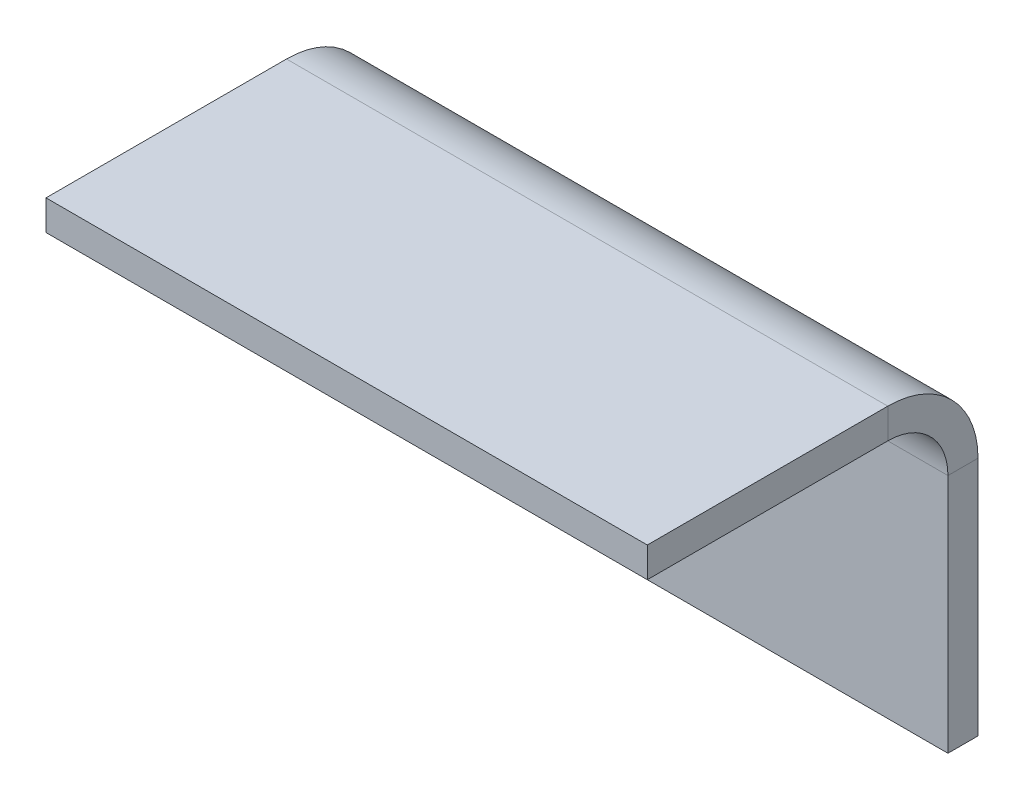
ISO-10303-21;
HEADER;
FILE_DESCRIPTION(('STEP AP214'),'2;1');
FILE_NAME('part.step','',(''),(''),'','','');
FILE_SCHEMA(('AUTOMOTIVE_DESIGN { 1 0 10303 214 1 1 1 1 }'));
ENDSEC;
DATA;
#1=APPLICATION_CONTEXT('core data for automotive mechanical design processes');
#2=APPLICATION_PROTOCOL_DEFINITION('international standard','automotive_design',2000,#1);
#3=PRODUCT_CONTEXT('',#1,'mechanical');
#4=PRODUCT('Part','Part','',(#3));
#5=PRODUCT_RELATED_PRODUCT_CATEGORY('part','',(#4));
#6=PRODUCT_DEFINITION_FORMATION('','',#4);
#7=PRODUCT_DEFINITION_CONTEXT('part definition',#1,'design');
#8=PRODUCT_DEFINITION('design','',#6,#7);
#9=PRODUCT_DEFINITION_SHAPE('','',#8);
#10=(LENGTH_UNIT() NAMED_UNIT(*) SI_UNIT(.MILLI.,.METRE.));
#11=(NAMED_UNIT(*) PLANE_ANGLE_UNIT() SI_UNIT($,.RADIAN.));
#12=(NAMED_UNIT(*) SI_UNIT($,.STERADIAN.) SOLID_ANGLE_UNIT());
#13=UNCERTAINTY_MEASURE_WITH_UNIT(LENGTH_MEASURE(1.E-05),#10,'distance_accuracy_value','');
#14=(GEOMETRIC_REPRESENTATION_CONTEXT(3) GLOBAL_UNCERTAINTY_ASSIGNED_CONTEXT((#13)) GLOBAL_UNIT_ASSIGNED_CONTEXT((#10,
#11,#12)) REPRESENTATION_CONTEXT('',''));
#15=CARTESIAN_POINT('',(0.,0.,0.));
#16=DIRECTION('',(0.,0.,1.));
#17=DIRECTION('',(1.,0.,0.));
#18=AXIS2_PLACEMENT_3D('',#15,#16,#17);
#19=CARTESIAN_POINT('',(0.,0.,-1.));
#20=DIRECTION('',(-1.,0.,0.));
#21=DIRECTION('',(0.,0.,1.));
#22=AXIS2_PLACEMENT_3D('',#19,#20,#21);
#23=PLANE('',#22);
#24=DIRECTION('',(0.,-1.,0.));
#25=VECTOR('',#24,1.);
#26=CARTESIAN_POINT('',(0.,0.,0.));
#27=LINE('',#26,#25);
#28=CARTESIAN_POINT('',(0.,8.00000000000001,0.));
#29=VERTEX_POINT('',#28);
#30=CARTESIAN_POINT('',(0.,0.,0.));
#31=VERTEX_POINT('',#30);
#32=EDGE_CURVE('E96',#29,#31,#27,.T.);
#33=ORIENTED_EDGE('',*,*,#32,.F.);
#34=DIRECTION('',(0.,0.,-1.));
#35=VECTOR('',#34,1.);
#36=CARTESIAN_POINT('',(0.,8.00000000000001,0.));
#37=LINE('',#36,#35);
#38=CARTESIAN_POINT('',(0.,8.00000000000001,-1.));
#39=VERTEX_POINT('',#38);
#40=EDGE_CURVE('E104',#29,#39,#37,.T.);
#41=ORIENTED_EDGE('',*,*,#40,.T.);
#42=DIRECTION('',(0.,-1.,0.));
#43=VECTOR('',#42,1.);
#44=CARTESIAN_POINT('',(0.,0.,-1.));
#45=LINE('',#44,#43);
#46=CARTESIAN_POINT('',(0.,0.,-1.));
#47=VERTEX_POINT('',#46);
#48=EDGE_CURVE('E95',#39,#47,#45,.T.);
#49=ORIENTED_EDGE('',*,*,#48,.T.);
#50=DIRECTION('',(0.,0.,1.));
#51=VECTOR('',#50,1.);
#52=CARTESIAN_POINT('',(0.,0.,-1.));
#53=LINE('',#52,#51);
#54=EDGE_CURVE('E50',#47,#31,#53,.T.);
#55=ORIENTED_EDGE('',*,*,#54,.T.);
#56=EDGE_LOOP('',(#33,#41,#49,#55));
#57=FACE_BOUND('',#56,.T.);
#58=ADVANCED_FACE('F42',(#57),#23,.T.);
#59=CARTESIAN_POINT('',(0.,0.,-1.));
#60=DIRECTION('',(0.,0.,-1.));
#61=DIRECTION('',(-1.,0.,0.));
#62=AXIS2_PLACEMENT_3D('',#59,#60,#61);
#63=PLANE('',#62);
#64=ORIENTED_EDGE('',*,*,#48,.F.);
#65=DIRECTION('',(-1.,0.,0.));
#66=VECTOR('',#65,1.);
#67=CARTESIAN_POINT('',(0.,8.00000000000001,-1.));
#68=LINE('',#67,#66);
#69=CARTESIAN_POINT('',(20.,8.00000000000001,-1.));
#70=VERTEX_POINT('',#69);
#71=EDGE_CURVE('E125',#39,#70,#68,.F.);
#72=ORIENTED_EDGE('',*,*,#71,.T.);
#73=DIRECTION('',(0.,1.,0.));
#74=VECTOR('',#73,1.);
#75=CARTESIAN_POINT('',(20.,0.,-1.));
#76=LINE('',#75,#74);
#77=CARTESIAN_POINT('',(20.,0.,-1.));
#78=VERTEX_POINT('',#77);
#79=EDGE_CURVE('E101',#78,#70,#76,.T.);
#80=ORIENTED_EDGE('',*,*,#79,.F.);
#81=DIRECTION('',(1.,0.,0.));
#82=VECTOR('',#81,1.);
#83=CARTESIAN_POINT('',(0.,0.,-1.));
#84=LINE('',#83,#82);
#85=EDGE_CURVE('E84',#47,#78,#84,.T.);
#86=ORIENTED_EDGE('',*,*,#85,.F.);
#87=EDGE_LOOP('',(#64,#72,#80,#86));
#88=FACE_BOUND('',#87,.T.);
#89=ADVANCED_FACE('F212',(#88),#63,.T.);
#90=CARTESIAN_POINT('',(0.,0.,0.));
#91=DIRECTION('',(0.,0.,-1.));
#92=DIRECTION('',(-1.,0.,0.));
#93=AXIS2_PLACEMENT_3D('',#90,#91,#92);
#94=PLANE('',#93);
#95=DIRECTION('',(-1.,0.,0.));
#96=VECTOR('',#95,1.);
#97=CARTESIAN_POINT('',(0.,8.00000000000001,0.));
#98=LINE('',#97,#96);
#99=CARTESIAN_POINT('',(20.,8.00000000000001,0.));
#100=VERTEX_POINT('',#99);
#101=EDGE_CURVE('E115',#29,#100,#98,.F.);
#102=ORIENTED_EDGE('',*,*,#101,.F.);
#103=ORIENTED_EDGE('',*,*,#32,.T.);
#104=DIRECTION('',(1.,0.,0.));
#105=VECTOR('',#104,1.);
#106=CARTESIAN_POINT('',(0.,0.,0.));
#107=LINE('',#106,#105);
#108=CARTESIAN_POINT('',(20.,0.,0.));
#109=VERTEX_POINT('',#108);
#110=EDGE_CURVE('E81',#31,#109,#107,.T.);
#111=ORIENTED_EDGE('',*,*,#110,.T.);
#112=DIRECTION('',(0.,1.,0.));
#113=VECTOR('',#112,1.);
#114=CARTESIAN_POINT('',(20.,0.,0.));
#115=LINE('',#114,#113);
#116=EDGE_CURVE('E88',#109,#100,#115,.T.);
#117=ORIENTED_EDGE('',*,*,#116,.T.);
#118=EDGE_LOOP('',(#102,#103,#111,#117));
#119=FACE_BOUND('',#118,.T.);
#120=ADVANCED_FACE('F94',(#119),#94,.F.);
#121=CARTESIAN_POINT('',(20.,0.,-1.));
#122=DIRECTION('',(1.,0.,0.));
#123=DIRECTION('',(0.,0.,-1.));
#124=AXIS2_PLACEMENT_3D('',#121,#122,#123);
#125=PLANE('',#124);
#126=DIRECTION('',(0.,0.,-1.));
#127=VECTOR('',#126,1.);
#128=CARTESIAN_POINT('',(20.,8.00000000000001,0.));
#129=LINE('',#128,#127);
#130=EDGE_CURVE('E90',#100,#70,#129,.T.);
#131=ORIENTED_EDGE('',*,*,#130,.F.);
#132=ORIENTED_EDGE('',*,*,#116,.F.);
#133=DIRECTION('',(0.,0.,1.));
#134=VECTOR('',#133,1.);
#135=CARTESIAN_POINT('',(20.,0.,-1.));
#136=LINE('',#135,#134);
#137=EDGE_CURVE('E11',#78,#109,#136,.T.);
#138=ORIENTED_EDGE('',*,*,#137,.F.);
#139=ORIENTED_EDGE('',*,*,#79,.T.);
#140=EDGE_LOOP('',(#131,#132,#138,#139));
#141=FACE_BOUND('',#140,.T.);
#142=ADVANCED_FACE('F87',(#141),#125,.T.);
#143=CARTESIAN_POINT('',(0.,0.,-1.));
#144=DIRECTION('',(0.,-1.,0.));
#145=DIRECTION('',(0.,0.,-1.));
#146=AXIS2_PLACEMENT_3D('',#143,#144,#145);
#147=PLANE('',#146);
#148=ORIENTED_EDGE('',*,*,#110,.F.);
#149=ORIENTED_EDGE('',*,*,#54,.F.);
#150=ORIENTED_EDGE('',*,*,#85,.T.);
#151=ORIENTED_EDGE('',*,*,#137,.T.);
#152=EDGE_LOOP('',(#148,#149,#150,#151));
#153=FACE_BOUND('',#152,.T.);
#154=ADVANCED_FACE('F77',(#153),#147,.T.);
#155=CARTESIAN_POINT('',(20.,8.00000000000001,2.));
#156=DIRECTION('',(1.,0.,0.));
#157=DIRECTION('',(0.,0.,-1.));
#158=AXIS2_PLACEMENT_3D('',#155,#156,#157);
#159=PLANE('',#158);
#160=DIRECTION('',(0.,1.,0.));
#161=VECTOR('',#160,1.);
#162=CARTESIAN_POINT('',(20.,10.,1.99999999999999));
#163=LINE('',#162,#161);
#164=CARTESIAN_POINT('',(20.,10.,1.99999999999999));
#165=VERTEX_POINT('',#164);
#166=CARTESIAN_POINT('',(20.,11.,1.99999999999998));
#167=VERTEX_POINT('',#166);
#168=EDGE_CURVE('E155',#165,#167,#163,.T.);
#169=ORIENTED_EDGE('',*,*,#168,.F.);
#170=CARTESIAN_POINT('',(20.,8.00000000000001,2.));
#171=DIRECTION('',(-1.,0.,0.));
#172=DIRECTION('',(0.,0.,1.));
#173=AXIS2_PLACEMENT_3D('',#170,#171,#172);
#174=CIRCLE('',#173,2.);
#175=EDGE_CURVE('E118',#100,#165,#174,.F.);
#176=ORIENTED_EDGE('',*,*,#175,.F.);
#177=ORIENTED_EDGE('',*,*,#130,.T.);
#178=CARTESIAN_POINT('',(20.,8.00000000000001,2.));
#179=DIRECTION('',(-1.,0.,0.));
#180=DIRECTION('',(0.,0.,1.));
#181=AXIS2_PLACEMENT_3D('',#178,#179,#180);
#182=CIRCLE('',#181,3.);
#183=EDGE_CURVE('E59',#70,#167,#182,.F.);
#184=ORIENTED_EDGE('',*,*,#183,.T.);
#185=EDGE_LOOP('',(#169,#176,#177,#184));
#186=FACE_BOUND('',#185,.T.);
#187=ADVANCED_FACE('F204',(#186),#159,.T.);
#188=CARTESIAN_POINT('',(0.,8.00000000000001,2.));
#189=DIRECTION('',(1.,0.,0.));
#190=DIRECTION('',(0.,0.,-1.));
#191=AXIS2_PLACEMENT_3D('',#188,#189,#190);
#192=PLANE('',#191);
#193=CARTESIAN_POINT('',(0.,8.00000000000001,2.));
#194=DIRECTION('',(-1.,0.,0.));
#195=DIRECTION('',(0.,0.,1.));
#196=AXIS2_PLACEMENT_3D('',#193,#194,#195);
#197=CIRCLE('',#196,2.);
#198=CARTESIAN_POINT('',(0.,10.,1.99999999999999));
#199=VERTEX_POINT('',#198);
#200=EDGE_CURVE('E108',#199,#29,#197,.T.);
#201=ORIENTED_EDGE('',*,*,#200,.F.);
#202=DIRECTION('',(0.,1.,0.));
#203=VECTOR('',#202,1.);
#204=CARTESIAN_POINT('',(0.,10.,1.99999999999999));
#205=LINE('',#204,#203);
#206=CARTESIAN_POINT('',(0.,11.,1.99999999999998));
#207=VERTEX_POINT('',#206);
#208=EDGE_CURVE('E151',#199,#207,#205,.T.);
#209=ORIENTED_EDGE('',*,*,#208,.T.);
#210=CARTESIAN_POINT('',(0.,8.00000000000001,2.));
#211=DIRECTION('',(-1.,0.,0.));
#212=DIRECTION('',(0.,0.,1.));
#213=AXIS2_PLACEMENT_3D('',#210,#211,#212);
#214=CIRCLE('',#213,3.);
#215=EDGE_CURVE('E120',#207,#39,#214,.T.);
#216=ORIENTED_EDGE('',*,*,#215,.T.);
#217=ORIENTED_EDGE('',*,*,#40,.F.);
#218=EDGE_LOOP('',(#201,#209,#216,#217));
#219=FACE_BOUND('',#218,.T.);
#220=ADVANCED_FACE('F172',(#219),#192,.F.);
#221=CARTESIAN_POINT('',(0.,8.00000000000001,2.));
#222=DIRECTION('',(-1.,0.,0.));
#223=DIRECTION('',(0.,1.,0.));
#224=AXIS2_PLACEMENT_3D('',#221,#222,#223);
#225=CYLINDRICAL_SURFACE('',#224,3.);
#226=ORIENTED_EDGE('',*,*,#71,.F.);
#227=ORIENTED_EDGE('',*,*,#215,.F.);
#228=DIRECTION('',(1.,0.,0.));
#229=VECTOR('',#228,1.);
#230=CARTESIAN_POINT('',(0.,11.,1.99999999999998));
#231=LINE('',#230,#229);
#232=EDGE_CURVE('E142',#207,#167,#231,.T.);
#233=ORIENTED_EDGE('',*,*,#232,.T.);
#234=ORIENTED_EDGE('',*,*,#183,.F.);
#235=EDGE_LOOP('',(#226,#227,#233,#234));
#236=FACE_BOUND('',#235,.T.);
#237=ADVANCED_FACE('F209',(#236),#225,.T.);
#238=CARTESIAN_POINT('',(0.,8.00000000000001,2.));
#239=DIRECTION('',(-1.,0.,0.));
#240=DIRECTION('',(0.,1.,0.));
#241=AXIS2_PLACEMENT_3D('',#238,#239,#240);
#242=CYLINDRICAL_SURFACE('',#241,2.);
#243=ORIENTED_EDGE('',*,*,#101,.T.);
#244=ORIENTED_EDGE('',*,*,#175,.T.);
#245=DIRECTION('',(-1.,0.,0.));
#246=VECTOR('',#245,1.);
#247=CARTESIAN_POINT('',(20.,10.,1.99999999999999));
#248=LINE('',#247,#246);
#249=EDGE_CURVE('E154',#165,#199,#248,.T.);
#250=ORIENTED_EDGE('',*,*,#249,.T.);
#251=ORIENTED_EDGE('',*,*,#200,.T.);
#252=EDGE_LOOP('',(#243,#244,#250,#251));
#253=FACE_BOUND('',#252,.T.);
#254=ADVANCED_FACE('F162',(#253),#242,.F.);
#255=CARTESIAN_POINT('',(20.,11.,0.));
#256=DIRECTION('',(-1.,0.,0.));
#257=DIRECTION('',(0.,0.,1.));
#258=AXIS2_PLACEMENT_3D('',#255,#256,#257);
#259=PLANE('',#258);
#260=ORIENTED_EDGE('',*,*,#168,.T.);
#261=DIRECTION('',(0.,0.,-1.));
#262=VECTOR('',#261,1.);
#263=CARTESIAN_POINT('',(20.,11.,0.));
#264=LINE('',#263,#262);
#265=CARTESIAN_POINT('',(20.,11.0000000000001,9.99999999999999));
#266=VERTEX_POINT('',#265);
#267=EDGE_CURVE('E131',#266,#167,#264,.T.);
#268=ORIENTED_EDGE('',*,*,#267,.F.);
#269=DIRECTION('',(0.,-1.,0.));
#270=VECTOR('',#269,1.);
#271=CARTESIAN_POINT('',(20.,11.0000000000001,9.99999999999999));
#272=LINE('',#271,#270);
#273=CARTESIAN_POINT('',(20.,10.0000000000001,10.));
#274=VERTEX_POINT('',#273);
#275=EDGE_CURVE('E126',#266,#274,#272,.T.);
#276=ORIENTED_EDGE('',*,*,#275,.T.);
#277=DIRECTION('',(0.,0.,-1.));
#278=VECTOR('',#277,1.);
#279=CARTESIAN_POINT('',(20.,10.,0.));
#280=LINE('',#279,#278);
#281=EDGE_CURVE('E138',#274,#165,#280,.T.);
#282=ORIENTED_EDGE('',*,*,#281,.T.);
#283=EDGE_LOOP('',(#260,#268,#276,#282));
#284=FACE_BOUND('',#283,.T.);
#285=ADVANCED_FACE('F210',(#284),#259,.F.);
#286=CARTESIAN_POINT('',(0.,11.,0.));
#287=DIRECTION('',(1.,0.,0.));
#288=DIRECTION('',(0.,0.,-1.));
#289=AXIS2_PLACEMENT_3D('',#286,#287,#288);
#290=PLANE('',#289);
#291=ORIENTED_EDGE('',*,*,#208,.F.);
#292=DIRECTION('',(0.,0.,1.));
#293=VECTOR('',#292,1.);
#294=CARTESIAN_POINT('',(0.,10.,0.));
#295=LINE('',#294,#293);
#296=CARTESIAN_POINT('',(0.,10.0000000000001,10.));
#297=VERTEX_POINT('',#296);
#298=EDGE_CURVE('E136',#199,#297,#295,.T.);
#299=ORIENTED_EDGE('',*,*,#298,.T.);
#300=DIRECTION('',(0.,-1.,0.));
#301=VECTOR('',#300,1.);
#302=CARTESIAN_POINT('',(0.,11.0000000000001,9.99999999999999));
#303=LINE('',#302,#301);
#304=CARTESIAN_POINT('',(0.,11.0000000000001,9.99999999999999));
#305=VERTEX_POINT('',#304);
#306=EDGE_CURVE('E114',#305,#297,#303,.T.);
#307=ORIENTED_EDGE('',*,*,#306,.F.);
#308=DIRECTION('',(0.,0.,1.));
#309=VECTOR('',#308,1.);
#310=CARTESIAN_POINT('',(0.,11.,0.));
#311=LINE('',#310,#309);
#312=EDGE_CURVE('E144',#207,#305,#311,.T.);
#313=ORIENTED_EDGE('',*,*,#312,.F.);
#314=EDGE_LOOP('',(#291,#299,#307,#313));
#315=FACE_BOUND('',#314,.T.);
#316=ADVANCED_FACE('F176',(#315),#290,.F.);
#317=CARTESIAN_POINT('',(0.,11.,0.));
#318=DIRECTION('',(0.,-1.,0.));
#319=DIRECTION('',(0.,0.,-1.));
#320=AXIS2_PLACEMENT_3D('',#317,#318,#319);
#321=PLANE('',#320);
#322=ORIENTED_EDGE('',*,*,#232,.F.);
#323=ORIENTED_EDGE('',*,*,#312,.T.);
#324=DIRECTION('',(1.,0.,0.));
#325=VECTOR('',#324,1.);
#326=CARTESIAN_POINT('',(2.,11.0000000000001,9.99999999999999));
#327=LINE('',#326,#325);
#328=EDGE_CURVE('E133',#305,#266,#327,.T.);
#329=ORIENTED_EDGE('',*,*,#328,.T.);
#330=ORIENTED_EDGE('',*,*,#267,.T.);
#331=EDGE_LOOP('',(#322,#323,#329,#330));
#332=FACE_BOUND('',#331,.T.);
#333=ADVANCED_FACE('F208',(#332),#321,.F.);
#334=CARTESIAN_POINT('',(0.,10.,0.));
#335=DIRECTION('',(0.,-1.,0.));
#336=DIRECTION('',(0.,0.,-1.));
#337=AXIS2_PLACEMENT_3D('',#334,#335,#336);
#338=PLANE('',#337);
#339=ORIENTED_EDGE('',*,*,#298,.F.);
#340=ORIENTED_EDGE('',*,*,#249,.F.);
#341=ORIENTED_EDGE('',*,*,#281,.F.);
#342=DIRECTION('',(1.,0.,0.));
#343=VECTOR('',#342,1.);
#344=CARTESIAN_POINT('',(20.,10.0000000000001,10.));
#345=LINE('',#344,#343);
#346=EDGE_CURVE('E134',#297,#274,#345,.T.);
#347=ORIENTED_EDGE('',*,*,#346,.F.);
#348=EDGE_LOOP('',(#339,#340,#341,#347));
#349=FACE_BOUND('',#348,.T.);
#350=ADVANCED_FACE('F185',(#349),#338,.T.);
#351=CARTESIAN_POINT('',(20.,11.0000000000001,9.99999999999999));
#352=DIRECTION('',(0.,0.,-1.));
#353=DIRECTION('',(0.,1.,0.));
#354=AXIS2_PLACEMENT_3D('',#351,#352,#353);
#355=PLANE('',#354);
#356=ORIENTED_EDGE('',*,*,#346,.T.);
#357=ORIENTED_EDGE('',*,*,#275,.F.);
#358=ORIENTED_EDGE('',*,*,#328,.F.);
#359=ORIENTED_EDGE('',*,*,#306,.T.);
#360=EDGE_LOOP('',(#356,#357,#358,#359));
#361=FACE_BOUND('',#360,.T.);
#362=ADVANCED_FACE('F187',(#361),#355,.F.);
#363=CLOSED_SHELL('',(#58,#89,#120,#142,#154,#187,#220,#237,#254,#285,#316,#333,#350,#362));
#364=MANIFOLD_SOLID_BREP('B2',#363);
#365=ADVANCED_BREP_SHAPE_REPRESENTATION('',(#18,#364),#14);
#366=SHAPE_DEFINITION_REPRESENTATION(#9,#365);
ENDSEC;
END-ISO-10303-21;
